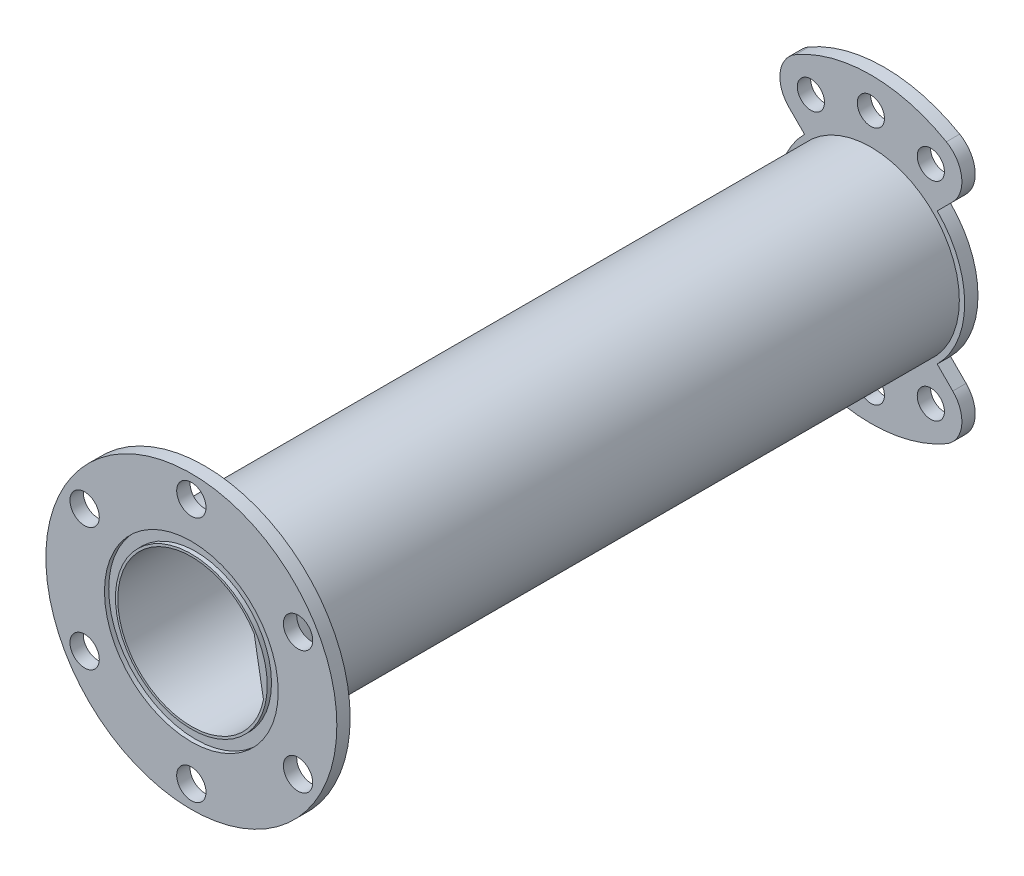
ISO-10303-21;
HEADER;
FILE_DESCRIPTION(('STEP AP214'),'2;1');
FILE_NAME('part.step','',(''),(''),'','','');
FILE_SCHEMA(('AUTOMOTIVE_DESIGN { 1 0 10303 214 1 1 1 1 }'));
ENDSEC;
DATA;
#1=APPLICATION_CONTEXT('core data for automotive mechanical design processes');
#2=APPLICATION_PROTOCOL_DEFINITION('international standard','automotive_design',2000,#1);
#3=PRODUCT_CONTEXT('',#1,'mechanical');
#4=PRODUCT('Part','Part','',(#3));
#5=PRODUCT_RELATED_PRODUCT_CATEGORY('part','',(#4));
#6=PRODUCT_DEFINITION_FORMATION('','',#4);
#7=PRODUCT_DEFINITION_CONTEXT('part definition',#1,'design');
#8=PRODUCT_DEFINITION('design','',#6,#7);
#9=PRODUCT_DEFINITION_SHAPE('','',#8);
#10=(LENGTH_UNIT() NAMED_UNIT(*) SI_UNIT(.MILLI.,.METRE.));
#11=(NAMED_UNIT(*) PLANE_ANGLE_UNIT() SI_UNIT($,.RADIAN.));
#12=(NAMED_UNIT(*) SI_UNIT($,.STERADIAN.) SOLID_ANGLE_UNIT());
#13=UNCERTAINTY_MEASURE_WITH_UNIT(LENGTH_MEASURE(1.E-05),#10,'distance_accuracy_value','');
#14=(GEOMETRIC_REPRESENTATION_CONTEXT(3) GLOBAL_UNCERTAINTY_ASSIGNED_CONTEXT((#13)) GLOBAL_UNIT_ASSIGNED_CONTEXT((#10,
#11,#12)) REPRESENTATION_CONTEXT('',''));
#15=CARTESIAN_POINT('',(0.,0.,0.));
#16=DIRECTION('',(0.,0.,1.));
#17=DIRECTION('',(1.,0.,0.));
#18=AXIS2_PLACEMENT_3D('',#15,#16,#17);
#19=CARTESIAN_POINT('',(-14.2875,24.7466759131403,127.));
#20=DIRECTION('',(0.,0.,-1.));
#21=DIRECTION('',(-1.,0.,0.));
#22=AXIS2_PLACEMENT_3D('',#19,#20,#21);
#23=CYLINDRICAL_SURFACE('',#22,7.39575421380445);
#24=DIRECTION('',(0.,0.,-1.));
#25=VECTOR('',#24,1.);
#26=CARTESIAN_POINT('',(-19.5170879565702,19.5170879565702,127.));
#27=LINE('',#26,#25);
#28=CARTESIAN_POINT('',(-19.5170879565702,19.5170879565702,-34.925));
#29=VERTEX_POINT('',#28);
#30=CARTESIAN_POINT('',(-19.5170879565701,19.5170879565702,-38.1));
#31=VERTEX_POINT('',#30);
#32=EDGE_CURVE('E158',#29,#31,#27,.T.);
#33=ORIENTED_EDGE('',*,*,#32,.F.);
#34=CARTESIAN_POINT('',(-14.2875,24.7466759131403,-34.925));
#35=DIRECTION('',(0.,0.,1.));
#36=DIRECTION('',(1.,0.,0.));
#37=AXIS2_PLACEMENT_3D('',#34,#35,#36);
#38=CIRCLE('',#37,7.39575421380445);
#39=CARTESIAN_POINT('',(-17.9853771069023,31.1515869424408,-34.925));
#40=VERTEX_POINT('',#39);
#41=EDGE_CURVE('E144',#40,#29,#38,.T.);
#42=ORIENTED_EDGE('',*,*,#41,.F.);
#43=DIRECTION('',(0.,0.,-1.));
#44=VECTOR('',#43,1.);
#45=CARTESIAN_POINT('',(-17.9853771069023,31.1515869424408,39.5083940674089));
#46=LINE('',#45,#44);
#47=CARTESIAN_POINT('',(-17.9853771069023,31.1515869424408,-38.1));
#48=VERTEX_POINT('',#47);
#49=EDGE_CURVE('E357',#40,#48,#46,.T.);
#50=ORIENTED_EDGE('',*,*,#49,.T.);
#51=CARTESIAN_POINT('',(-14.2875,24.7466759131403,-38.1));
#52=DIRECTION('',(0.,0.,-1.));
#53=DIRECTION('',(-1.,0.,0.));
#54=AXIS2_PLACEMENT_3D('',#51,#52,#53);
#55=CIRCLE('',#54,7.39575421380445);
#56=EDGE_CURVE('E166',#31,#48,#55,.T.);
#57=ORIENTED_EDGE('',*,*,#56,.F.);
#58=EDGE_LOOP('',(#33,#42,#50,#57));
#59=FACE_BOUND('',#58,.T.);
#60=ADVANCED_FACE('F43',(#59),#23,.T.);
#61=CARTESIAN_POINT('',(0.,0.,127.));
#62=DIRECTION('',(-0.707106781186549,-0.707106781186546,0.));
#63=DIRECTION('',(0.707106781186546,-0.707106781186549,0.));
#64=AXIS2_PLACEMENT_3D('',#61,#62,#63);
#65=PLANE('',#64);
#66=DIRECTION('',(0.,0.,-1.));
#67=VECTOR('',#66,1.);
#68=CARTESIAN_POINT('',(-15.8052507730817,15.8052507730817,60.0460030923268));
#69=LINE('',#68,#67);
#70=CARTESIAN_POINT('',(-15.8052507730817,15.8052507730817,-34.925));
#71=VERTEX_POINT('',#70);
#72=CARTESIAN_POINT('',(-15.8052507730817,15.8052507730817,-38.1));
#73=VERTEX_POINT('',#72);
#74=EDGE_CURVE('E160',#71,#73,#69,.T.);
#75=ORIENTED_EDGE('',*,*,#74,.F.);
#76=DIRECTION('',(0.707106781186546,-0.707106781186549,0.));
#77=VECTOR('',#76,1.);
#78=CARTESIAN_POINT('',(0.,0.,-34.925));
#79=LINE('',#78,#77);
#80=EDGE_CURVE('E61',#29,#71,#79,.T.);
#81=ORIENTED_EDGE('',*,*,#80,.F.);
#82=ORIENTED_EDGE('',*,*,#32,.T.);
#83=DIRECTION('',(-0.707106781186546,0.707106781186549,0.));
#84=VECTOR('',#83,1.);
#85=CARTESIAN_POINT('',(0.,0.,-38.1));
#86=LINE('',#85,#84);
#87=EDGE_CURVE('E256',#73,#31,#86,.T.);
#88=ORIENTED_EDGE('',*,*,#87,.F.);
#89=EDGE_LOOP('',(#75,#81,#82,#88));
#90=FACE_BOUND('',#89,.T.);
#91=ADVANCED_FACE('F156',(#90),#65,.T.);
#92=CARTESIAN_POINT('',(0.,0.,127.));
#93=DIRECTION('',(0.707106781186539,-0.707106781186556,0.));
#94=DIRECTION('',(0.707106781186556,0.707106781186539,0.));
#95=AXIS2_PLACEMENT_3D('',#92,#93,#94);
#96=PLANE('',#95);
#97=DIRECTION('',(-0.707106781186556,-0.707106781186539,0.));
#98=VECTOR('',#97,1.);
#99=CARTESIAN_POINT('',(0.,0.,-34.925));
#100=LINE('',#99,#98);
#101=CARTESIAN_POINT('',(-15.8052507730819,-15.8052507730815,-34.925));
#102=VERTEX_POINT('',#101);
#103=CARTESIAN_POINT('',(-19.5170879565701,-19.5170879565701,-34.925));
#104=VERTEX_POINT('',#103);
#105=EDGE_CURVE('E214',#102,#104,#100,.T.);
#106=ORIENTED_EDGE('',*,*,#105,.F.);
#107=DIRECTION('',(0.,0.,-1.));
#108=VECTOR('',#107,1.);
#109=CARTESIAN_POINT('',(-15.8052507730819,-15.8052507730815,60.0460030923268));
#110=LINE('',#109,#108);
#111=CARTESIAN_POINT('',(-15.8052507730819,-15.8052507730815,-38.1));
#112=VERTEX_POINT('',#111);
#113=EDGE_CURVE('E328',#102,#112,#110,.T.);
#114=ORIENTED_EDGE('',*,*,#113,.T.);
#115=DIRECTION('',(0.707106781186556,0.707106781186539,0.));
#116=VECTOR('',#115,1.);
#117=CARTESIAN_POINT('',(0.,0.,-38.1));
#118=LINE('',#117,#116);
#119=CARTESIAN_POINT('',(-19.5170879565701,-19.5170879565701,-38.1));
#120=VERTEX_POINT('',#119);
#121=EDGE_CURVE('E248',#120,#112,#118,.T.);
#122=ORIENTED_EDGE('',*,*,#121,.F.);
#123=DIRECTION('',(0.,0.,-1.));
#124=VECTOR('',#123,1.);
#125=CARTESIAN_POINT('',(-19.5170879565703,-19.5170879565698,127.));
#126=LINE('',#125,#124);
#127=EDGE_CURVE('E168',#104,#120,#126,.T.);
#128=ORIENTED_EDGE('',*,*,#127,.F.);
#129=EDGE_LOOP('',(#106,#114,#122,#128));
#130=FACE_BOUND('',#129,.T.);
#131=ADVANCED_FACE('F413',(#130),#96,.F.);
#132=CARTESIAN_POINT('',(-14.2874999999999,-24.7466759131404,127.));
#133=DIRECTION('',(0.,0.,-1.));
#134=DIRECTION('',(-1.,0.,0.));
#135=AXIS2_PLACEMENT_3D('',#132,#133,#134);
#136=CYLINDRICAL_SURFACE('',#135,7.39575421380469);
#137=DIRECTION('',(0.,0.,-1.));
#138=VECTOR('',#137,1.);
#139=CARTESIAN_POINT('',(-17.9853771069021,-31.1515869424411,39.5083940674089));
#140=LINE('',#139,#138);
#141=CARTESIAN_POINT('',(-17.985377106902,-31.1515869424409,-34.925));
#142=VERTEX_POINT('',#141);
#143=CARTESIAN_POINT('',(-17.9853771069022,-31.1515869424411,-38.1));
#144=VERTEX_POINT('',#143);
#145=EDGE_CURVE('E169',#142,#144,#140,.T.);
#146=ORIENTED_EDGE('',*,*,#145,.F.);
#147=CARTESIAN_POINT('',(-14.2874999999999,-24.7466759131404,-34.925));
#148=DIRECTION('',(0.,0.,1.));
#149=DIRECTION('',(1.,0.,0.));
#150=AXIS2_PLACEMENT_3D('',#147,#148,#149);
#151=CIRCLE('',#150,7.39575421380469);
#152=EDGE_CURVE('E217',#104,#142,#151,.T.);
#153=ORIENTED_EDGE('',*,*,#152,.F.);
#154=ORIENTED_EDGE('',*,*,#127,.T.);
#155=CARTESIAN_POINT('',(-14.2874999999999,-24.7466759131404,-38.1));
#156=DIRECTION('',(0.,0.,-1.));
#157=DIRECTION('',(-1.,0.,0.));
#158=AXIS2_PLACEMENT_3D('',#155,#156,#157);
#159=CIRCLE('',#158,7.39575421380469);
#160=EDGE_CURVE('E244',#144,#120,#159,.T.);
#161=ORIENTED_EDGE('',*,*,#160,.F.);
#162=EDGE_LOOP('',(#146,#153,#154,#161));
#163=FACE_BOUND('',#162,.T.);
#164=ADVANCED_FACE('F404',(#163),#136,.T.);
#165=CARTESIAN_POINT('',(14.2875000000002,-24.7466759131402,127.));
#166=DIRECTION('',(0.,0.,-1.));
#167=DIRECTION('',(-1.,0.,0.));
#168=AXIS2_PLACEMENT_3D('',#165,#166,#167);
#169=CYLINDRICAL_SURFACE('',#168,7.3957542138043);
#170=DIRECTION('',(0.,0.,-1.));
#171=VECTOR('',#170,1.);
#172=CARTESIAN_POINT('',(19.5170879565701,-19.5170879565704,127.));
#173=LINE('',#172,#171);
#174=CARTESIAN_POINT('',(19.5170879565701,-19.5170879565704,-34.925));
#175=VERTEX_POINT('',#174);
#176=CARTESIAN_POINT('',(19.5170879565703,-19.5170879565703,-38.1));
#177=VERTEX_POINT('',#176);
#178=EDGE_CURVE('E53',#175,#177,#173,.T.);
#179=ORIENTED_EDGE('',*,*,#178,.F.);
#180=CARTESIAN_POINT('',(14.2875000000002,-24.7466759131402,-34.925));
#181=DIRECTION('',(0.,0.,1.));
#182=DIRECTION('',(1.,0.,0.));
#183=AXIS2_PLACEMENT_3D('',#180,#181,#182);
#184=CIRCLE('',#183,7.3957542138043);
#185=CARTESIAN_POINT('',(17.9853771069024,-31.1515869424405,-34.925));
#186=VERTEX_POINT('',#185);
#187=EDGE_CURVE('E223',#186,#175,#184,.T.);
#188=ORIENTED_EDGE('',*,*,#187,.F.);
#189=DIRECTION('',(0.,0.,-1.));
#190=VECTOR('',#189,1.);
#191=CARTESIAN_POINT('',(17.9853771069024,-31.1515869424405,39.5083940674089));
#192=LINE('',#191,#190);
#193=CARTESIAN_POINT('',(17.9853771069025,-31.1515869424406,-38.1));
#194=VERTEX_POINT('',#193);
#195=EDGE_CURVE('E175',#186,#194,#192,.T.);
#196=ORIENTED_EDGE('',*,*,#195,.T.);
#197=CARTESIAN_POINT('',(14.2875000000002,-24.7466759131402,-38.1));
#198=DIRECTION('',(0.,0.,-1.));
#199=DIRECTION('',(-1.,0.,0.));
#200=AXIS2_PLACEMENT_3D('',#197,#198,#199);
#201=CIRCLE('',#200,7.3957542138043);
#202=EDGE_CURVE('E281',#177,#194,#201,.T.);
#203=ORIENTED_EDGE('',*,*,#202,.F.);
#204=EDGE_LOOP('',(#179,#188,#196,#203));
#205=FACE_BOUND('',#204,.T.);
#206=ADVANCED_FACE('F394',(#205),#169,.T.);
#207=CARTESIAN_POINT('',(0.,0.,127.));
#208=DIRECTION('',(0.707106781186554,0.707106781186541,0.));
#209=DIRECTION('',(-0.707106781186541,0.707106781186554,0.));
#210=AXIS2_PLACEMENT_3D('',#207,#208,#209);
#211=PLANE('',#210);
#212=DIRECTION('',(0.,0.,-1.));
#213=VECTOR('',#212,1.);
#214=CARTESIAN_POINT('',(15.8052507730816,-15.8052507730818,60.0460030923268));
#215=LINE('',#214,#213);
#216=CARTESIAN_POINT('',(15.8052507730816,-15.8052507730819,-34.925));
#217=VERTEX_POINT('',#216);
#218=CARTESIAN_POINT('',(15.8052507730816,-15.8052507730818,-38.1));
#219=VERTEX_POINT('',#218);
#220=EDGE_CURVE('E325',#217,#219,#215,.T.);
#221=ORIENTED_EDGE('',*,*,#220,.F.);
#222=DIRECTION('',(-0.707106781186541,0.707106781186554,0.));
#223=VECTOR('',#222,1.);
#224=CARTESIAN_POINT('',(0.,0.,-34.925));
#225=LINE('',#224,#223);
#226=EDGE_CURVE('E226',#175,#217,#225,.T.);
#227=ORIENTED_EDGE('',*,*,#226,.F.);
#228=ORIENTED_EDGE('',*,*,#178,.T.);
#229=DIRECTION('',(0.707106781186542,-0.707106781186554,0.));
#230=VECTOR('',#229,1.);
#231=CARTESIAN_POINT('',(0.,0.,-38.1));
#232=LINE('',#231,#230);
#233=EDGE_CURVE('E277',#219,#177,#232,.T.);
#234=ORIENTED_EDGE('',*,*,#233,.F.);
#235=EDGE_LOOP('',(#221,#227,#228,#234));
#236=FACE_BOUND('',#235,.T.);
#237=ADVANCED_FACE('F389',(#236),#211,.T.);
#238=CARTESIAN_POINT('',(0.,0.,127.));
#239=DIRECTION('',(-0.707106781186544,0.707106781186551,0.));
#240=DIRECTION('',(-0.707106781186551,-0.707106781186544,0.));
#241=AXIS2_PLACEMENT_3D('',#238,#239,#240);
#242=PLANE('',#241);
#243=DIRECTION('',(0.707106781186551,0.707106781186544,0.));
#244=VECTOR('',#243,1.);
#245=CARTESIAN_POINT('',(0.,0.,-34.925));
#246=LINE('',#245,#244);
#247=CARTESIAN_POINT('',(15.8052507730818,15.8052507730816,-34.925));
#248=VERTEX_POINT('',#247);
#249=CARTESIAN_POINT('',(19.5170879565702,19.51708795657,-34.925));
#250=VERTEX_POINT('',#249);
#251=EDGE_CURVE('E232',#248,#250,#246,.T.);
#252=ORIENTED_EDGE('',*,*,#251,.F.);
#253=DIRECTION('',(0.,0.,-1.));
#254=VECTOR('',#253,1.);
#255=CARTESIAN_POINT('',(15.8052507730818,15.8052507730816,60.0460030923268));
#256=LINE('',#255,#254);
#257=CARTESIAN_POINT('',(15.8052507730818,15.8052507730816,-38.1));
#258=VERTEX_POINT('',#257);
#259=EDGE_CURVE('E12',#248,#258,#256,.T.);
#260=ORIENTED_EDGE('',*,*,#259,.T.);
#261=DIRECTION('',(-0.707106781186551,-0.707106781186544,0.));
#262=VECTOR('',#261,1.);
#263=CARTESIAN_POINT('',(0.,0.,-38.1));
#264=LINE('',#263,#262);
#265=CARTESIAN_POINT('',(19.5170879565702,19.51708795657,-38.1));
#266=VERTEX_POINT('',#265);
#267=EDGE_CURVE('E269',#266,#258,#264,.T.);
#268=ORIENTED_EDGE('',*,*,#267,.F.);
#269=DIRECTION('',(0.,0.,-1.));
#270=VECTOR('',#269,1.);
#271=CARTESIAN_POINT('',(19.5170879565702,19.51708795657,127.));
#272=LINE('',#271,#270);
#273=EDGE_CURVE('E173',#250,#266,#272,.T.);
#274=ORIENTED_EDGE('',*,*,#273,.F.);
#275=EDGE_LOOP('',(#252,#260,#268,#274));
#276=FACE_BOUND('',#275,.T.);
#277=ADVANCED_FACE('F380',(#276),#242,.F.);
#278=CARTESIAN_POINT('',(14.2874999999997,24.7466759131405,127.));
#279=DIRECTION('',(0.,0.,-1.));
#280=DIRECTION('',(-1.,0.,0.));
#281=AXIS2_PLACEMENT_3D('',#278,#279,#280);
#282=CYLINDRICAL_SURFACE('',#281,7.39575421380503);
#283=DIRECTION('',(0.,0.,-1.));
#284=VECTOR('',#283,1.);
#285=CARTESIAN_POINT('',(17.9853771069021,31.1515869424415,39.5083940674089));
#286=LINE('',#285,#284);
#287=CARTESIAN_POINT('',(17.9853771069018,31.151586942441,-34.925));
#288=VERTEX_POINT('',#287);
#289=CARTESIAN_POINT('',(17.9853771069021,31.1515869424415,-38.1));
#290=VERTEX_POINT('',#289);
#291=EDGE_CURVE('E358',#288,#290,#286,.T.);
#292=ORIENTED_EDGE('',*,*,#291,.F.);
#293=CARTESIAN_POINT('',(14.2874999999997,24.7466759131405,-34.925));
#294=DIRECTION('',(0.,0.,1.));
#295=DIRECTION('',(1.,0.,0.));
#296=AXIS2_PLACEMENT_3D('',#293,#294,#295);
#297=CIRCLE('',#296,7.39575421380503);
#298=EDGE_CURVE('E235',#250,#288,#297,.T.);
#299=ORIENTED_EDGE('',*,*,#298,.F.);
#300=ORIENTED_EDGE('',*,*,#273,.T.);
#301=CARTESIAN_POINT('',(14.2874999999997,24.7466759131405,-38.1));
#302=DIRECTION('',(0.,0.,-1.));
#303=DIRECTION('',(-1.,0.,0.));
#304=AXIS2_PLACEMENT_3D('',#301,#302,#303);
#305=CIRCLE('',#304,7.39575421380503);
#306=EDGE_CURVE('E265',#290,#266,#305,.T.);
#307=ORIENTED_EDGE('',*,*,#306,.F.);
#308=EDGE_LOOP('',(#292,#299,#300,#307));
#309=FACE_BOUND('',#308,.T.);
#310=ADVANCED_FACE('F372',(#309),#282,.T.);
#311=CARTESIAN_POINT('',(0.,0.,39.5083940674089));
#312=DIRECTION('',(0.,0.,-1.));
#313=DIRECTION('',(-1.,0.,0.));
#314=AXIS2_PLACEMENT_3D('',#311,#312,#313);
#315=CYLINDRICAL_SURFACE('',#314,35.9707542138044);
#316=ORIENTED_EDGE('',*,*,#195,.F.);
#317=CARTESIAN_POINT('',(0.,0.,-34.925));
#318=DIRECTION('',(0.,0.,1.));
#319=DIRECTION('',(1.,0.,0.));
#320=AXIS2_PLACEMENT_3D('',#317,#318,#319);
#321=CIRCLE('',#320,35.9707542138044);
#322=EDGE_CURVE('E220',#142,#186,#321,.T.);
#323=ORIENTED_EDGE('',*,*,#322,.F.);
#324=ORIENTED_EDGE('',*,*,#145,.T.);
#325=CARTESIAN_POINT('',(0.,0.,-38.1));
#326=DIRECTION('',(0.,0.,-1.));
#327=DIRECTION('',(-1.,0.,0.));
#328=AXIS2_PLACEMENT_3D('',#325,#326,#327);
#329=CIRCLE('',#328,35.9707542138044);
#330=EDGE_CURVE('E285',#194,#144,#329,.T.);
#331=ORIENTED_EDGE('',*,*,#330,.F.);
#332=EDGE_LOOP('',(#316,#323,#324,#331));
#333=FACE_BOUND('',#332,.T.);
#334=ADVANCED_FACE('F399',(#333),#315,.T.);
#335=CARTESIAN_POINT('',(0.,0.,39.5083940674089));
#336=DIRECTION('',(0.,0.,-1.));
#337=DIRECTION('',(-1.,0.,0.));
#338=AXIS2_PLACEMENT_3D('',#335,#336,#337);
#339=CYLINDRICAL_SURFACE('',#338,35.9707542138044);
#340=ORIENTED_EDGE('',*,*,#49,.F.);
#341=CARTESIAN_POINT('',(0.,0.,-34.925));
#342=DIRECTION('',(0.,0.,1.));
#343=DIRECTION('',(1.,0.,0.));
#344=AXIS2_PLACEMENT_3D('',#341,#342,#343);
#345=CIRCLE('',#344,35.9707542138044);
#346=EDGE_CURVE('E147',#288,#40,#345,.T.);
#347=ORIENTED_EDGE('',*,*,#346,.F.);
#348=ORIENTED_EDGE('',*,*,#291,.T.);
#349=CARTESIAN_POINT('',(0.,0.,-38.1));
#350=DIRECTION('',(0.,0.,-1.));
#351=DIRECTION('',(-1.,0.,0.));
#352=AXIS2_PLACEMENT_3D('',#349,#350,#351);
#353=CIRCLE('',#352,35.9707542138044);
#354=EDGE_CURVE('E261',#48,#290,#353,.T.);
#355=ORIENTED_EDGE('',*,*,#354,.F.);
#356=EDGE_LOOP('',(#340,#347,#348,#355));
#357=FACE_BOUND('',#356,.T.);
#358=ADVANCED_FACE('F489',(#357),#339,.T.);
#359=CARTESIAN_POINT('',(0.,0.,60.0460030923268));
#360=DIRECTION('',(0.,0.,-1.));
#361=DIRECTION('',(-1.,0.,0.));
#362=AXIS2_PLACEMENT_3D('',#359,#360,#361);
#363=CYLINDRICAL_SURFACE('',#362,22.352);
#364=ORIENTED_EDGE('',*,*,#259,.F.);
#365=CARTESIAN_POINT('',(0.,0.,-34.925));
#366=DIRECTION('',(0.,0.,1.));
#367=DIRECTION('',(1.,0.,0.));
#368=AXIS2_PLACEMENT_3D('',#365,#366,#367);
#369=CIRCLE('',#368,22.352);
#370=EDGE_CURVE('E229',#217,#248,#369,.T.);
#371=ORIENTED_EDGE('',*,*,#370,.F.);
#372=ORIENTED_EDGE('',*,*,#220,.T.);
#373=CARTESIAN_POINT('',(0.,0.,-38.1));
#374=DIRECTION('',(0.,0.,-1.));
#375=DIRECTION('',(-1.,0.,0.));
#376=AXIS2_PLACEMENT_3D('',#373,#374,#375);
#377=CIRCLE('',#376,22.352);
#378=EDGE_CURVE('E273',#258,#219,#377,.T.);
#379=ORIENTED_EDGE('',*,*,#378,.F.);
#380=EDGE_LOOP('',(#364,#371,#372,#379));
#381=FACE_BOUND('',#380,.T.);
#382=ADVANCED_FACE('F384',(#381),#363,.T.);
#383=ORIENTED_EDGE('',*,*,#113,.F.);
#384=CARTESIAN_POINT('',(0.,0.,-34.925));
#385=DIRECTION('',(0.,0.,1.));
#386=DIRECTION('',(1.,0.,0.));
#387=AXIS2_PLACEMENT_3D('',#384,#385,#386);
#388=CIRCLE('',#387,22.352);
#389=EDGE_CURVE('E162',#71,#102,#388,.T.);
#390=ORIENTED_EDGE('',*,*,#389,.F.);
#391=ORIENTED_EDGE('',*,*,#74,.T.);
#392=CARTESIAN_POINT('',(0.,0.,-38.1));
#393=DIRECTION('',(0.,0.,-1.));
#394=DIRECTION('',(-1.,0.,0.));
#395=AXIS2_PLACEMENT_3D('',#392,#393,#394);
#396=CIRCLE('',#395,22.352);
#397=EDGE_CURVE('E252',#112,#73,#396,.T.);
#398=ORIENTED_EDGE('',*,*,#397,.F.);
#399=EDGE_LOOP('',(#383,#390,#391,#398));
#400=FACE_BOUND('',#399,.T.);
#401=ADVANCED_FACE('F411',(#400),#363,.T.);
#402=CARTESIAN_POINT('',(0.,0.,123.825));
#403=DIRECTION('',(0.,0.,-1.));
#404=DIRECTION('',(-1.,0.,0.));
#405=AXIS2_PLACEMENT_3D('',#402,#403,#404);
#406=PLANE('',#405);
#407=CARTESIAN_POINT('',(0.,29.3624,123.825));
#408=DIRECTION('',(0.,0.,-1.));
#409=DIRECTION('',(-1.,0.,0.));
#410=AXIS2_PLACEMENT_3D('',#407,#408,#409);
#411=CIRCLE('',#410,3.4925);
#412=CARTESIAN_POINT('',(-3.4925,29.3624,123.825));
#413=VERTEX_POINT('',#412);
#414=EDGE_CURVE('E442',#413,#413,#411,.T.);
#415=ORIENTED_EDGE('',*,*,#414,.F.);
#416=EDGE_LOOP('',(#415));
#417=FACE_BOUND('',#416,.T.);
#418=CARTESIAN_POINT('',(-25.42858431608,14.6812000000003,123.825));
#419=DIRECTION('',(0.,0.,-1.));
#420=DIRECTION('',(-1.,0.,0.));
#421=AXIS2_PLACEMENT_3D('',#418,#419,#420);
#422=CIRCLE('',#421,3.4925);
#423=CARTESIAN_POINT('',(-28.92108431608,14.6812000000003,123.825));
#424=VERTEX_POINT('',#423);
#425=EDGE_CURVE('E446',#424,#424,#422,.T.);
#426=ORIENTED_EDGE('',*,*,#425,.F.);
#427=EDGE_LOOP('',(#426));
#428=FACE_BOUND('',#427,.T.);
#429=CARTESIAN_POINT('',(-25.4285843160803,-14.6811999999998,123.825));
#430=DIRECTION('',(0.,0.,-1.));
#431=DIRECTION('',(-1.,0.,0.));
#432=AXIS2_PLACEMENT_3D('',#429,#430,#431);
#433=CIRCLE('',#432,3.4925);
#434=CARTESIAN_POINT('',(-28.9210843160803,-14.6811999999998,123.825));
#435=VERTEX_POINT('',#434);
#436=EDGE_CURVE('E450',#435,#435,#433,.T.);
#437=ORIENTED_EDGE('',*,*,#436,.F.);
#438=EDGE_LOOP('',(#437));
#439=FACE_BOUND('',#438,.T.);
#440=CARTESIAN_POINT('',(0.,-29.3624,123.825));
#441=DIRECTION('',(0.,0.,-1.));
#442=DIRECTION('',(-1.,0.,0.));
#443=AXIS2_PLACEMENT_3D('',#440,#441,#442);
#444=CIRCLE('',#443,3.4925);
#445=CARTESIAN_POINT('',(-3.4925,-29.3624,123.825));
#446=VERTEX_POINT('',#445);
#447=EDGE_CURVE('E454',#446,#446,#444,.T.);
#448=ORIENTED_EDGE('',*,*,#447,.F.);
#449=EDGE_LOOP('',(#448));
#450=FACE_BOUND('',#449,.T.);
#451=CARTESIAN_POINT('',(25.4285843160801,-14.6812000000001,123.825));
#452=DIRECTION('',(0.,0.,-1.));
#453=DIRECTION('',(-1.,0.,0.));
#454=AXIS2_PLACEMENT_3D('',#451,#452,#453);
#455=CIRCLE('',#454,3.4925);
#456=CARTESIAN_POINT('',(21.9360843160801,-14.6812000000001,123.825));
#457=VERTEX_POINT('',#456);
#458=EDGE_CURVE('E458',#457,#457,#455,.T.);
#459=ORIENTED_EDGE('',*,*,#458,.F.);
#460=EDGE_LOOP('',(#459));
#461=FACE_BOUND('',#460,.T.);
#462=CARTESIAN_POINT('',(25.4285843160802,14.6811999999999,123.825));
#463=DIRECTION('',(0.,0.,-1.));
#464=DIRECTION('',(-1.,0.,0.));
#465=AXIS2_PLACEMENT_3D('',#462,#463,#464);
#466=CIRCLE('',#465,3.4925);
#467=CARTESIAN_POINT('',(21.9360843160802,14.6811999999999,123.825));
#468=VERTEX_POINT('',#467);
#469=EDGE_CURVE('E462',#468,#468,#466,.T.);
#470=ORIENTED_EDGE('',*,*,#469,.F.);
#471=EDGE_LOOP('',(#470));
#472=FACE_BOUND('',#471,.T.);
#473=CARTESIAN_POINT('',(0.,0.,123.825));
#474=DIRECTION('',(0.,0.,-1.));
#475=DIRECTION('',(-1.,0.,0.));
#476=AXIS2_PLACEMENT_3D('',#473,#474,#475);
#477=CIRCLE('',#476,34.671);
#478=CARTESIAN_POINT('',(-34.671,0.,123.825));
#479=VERTEX_POINT('',#478);
#480=EDGE_CURVE('E321',#479,#479,#477,.T.);
#481=ORIENTED_EDGE('',*,*,#480,.T.);
#482=EDGE_LOOP('',(#481));
#483=FACE_BOUND('',#482,.T.);
#484=CARTESIAN_POINT('',(0.,0.,123.825));
#485=DIRECTION('',(0.,0.,-1.));
#486=DIRECTION('',(-1.,0.,0.));
#487=AXIS2_PLACEMENT_3D('',#484,#485,#486);
#488=CIRCLE('',#487,21.082);
#489=CARTESIAN_POINT('',(-21.082,0.,123.825));
#490=VERTEX_POINT('',#489);
#491=EDGE_CURVE('E353',#490,#490,#488,.T.);
#492=ORIENTED_EDGE('',*,*,#491,.F.);
#493=EDGE_LOOP('',(#492));
#494=FACE_BOUND('',#493,.T.);
#495=ADVANCED_FACE('F428',(#417,#428,#439,#450,#461,#472,#483,#494),#406,.T.);
#496=CARTESIAN_POINT('',(0.,0.,127.));
#497=DIRECTION('',(0.,0.,1.));
#498=DIRECTION('',(1.,0.,0.));
#499=AXIS2_PLACEMENT_3D('',#496,#497,#498);
#500=PLANE('',#499);
#501=CARTESIAN_POINT('',(0.,29.3624,127.));
#502=DIRECTION('',(0.,0.,1.));
#503=DIRECTION('',(1.,0.,0.));
#504=AXIS2_PLACEMENT_3D('',#501,#502,#503);
#505=CIRCLE('',#504,3.4925);
#506=CARTESIAN_POINT('',(3.4925,29.3624,127.));
#507=VERTEX_POINT('',#506);
#508=EDGE_CURVE('E584',#507,#507,#505,.T.);
#509=ORIENTED_EDGE('',*,*,#508,.F.);
#510=EDGE_LOOP('',(#509));
#511=FACE_BOUND('',#510,.T.);
#512=CARTESIAN_POINT('',(-25.42858431608,14.6812000000003,127.));
#513=DIRECTION('',(0.,0.,1.));
#514=DIRECTION('',(1.,0.,0.));
#515=AXIS2_PLACEMENT_3D('',#512,#513,#514);
#516=CIRCLE('',#515,3.4925);
#517=CARTESIAN_POINT('',(-21.93608431608,14.6812000000003,127.));
#518=VERTEX_POINT('',#517);
#519=EDGE_CURVE('E595',#518,#518,#516,.T.);
#520=ORIENTED_EDGE('',*,*,#519,.F.);
#521=EDGE_LOOP('',(#520));
#522=FACE_BOUND('',#521,.T.);
#523=CARTESIAN_POINT('',(-25.4285843160803,-14.6811999999998,127.));
#524=DIRECTION('',(0.,0.,1.));
#525=DIRECTION('',(1.,0.,0.));
#526=AXIS2_PLACEMENT_3D('',#523,#524,#525);
#527=CIRCLE('',#526,3.4925);
#528=CARTESIAN_POINT('',(-21.9360843160803,-14.6811999999998,127.));
#529=VERTEX_POINT('',#528);
#530=EDGE_CURVE('E598',#529,#529,#527,.T.);
#531=ORIENTED_EDGE('',*,*,#530,.F.);
#532=EDGE_LOOP('',(#531));
#533=FACE_BOUND('',#532,.T.);
#534=CARTESIAN_POINT('',(0.,-29.3624,127.));
#535=DIRECTION('',(0.,0.,1.));
#536=DIRECTION('',(1.,0.,0.));
#537=AXIS2_PLACEMENT_3D('',#534,#535,#536);
#538=CIRCLE('',#537,3.4925);
#539=CARTESIAN_POINT('',(3.4925,-29.3624,127.));
#540=VERTEX_POINT('',#539);
#541=EDGE_CURVE('E603',#540,#540,#538,.T.);
#542=ORIENTED_EDGE('',*,*,#541,.F.);
#543=EDGE_LOOP('',(#542));
#544=FACE_BOUND('',#543,.T.);
#545=CARTESIAN_POINT('',(25.4285843160801,-14.6812000000001,127.));
#546=DIRECTION('',(0.,0.,1.));
#547=DIRECTION('',(1.,0.,0.));
#548=AXIS2_PLACEMENT_3D('',#545,#546,#547);
#549=CIRCLE('',#548,3.4925);
#550=CARTESIAN_POINT('',(28.9210843160801,-14.6812000000001,127.));
#551=VERTEX_POINT('',#550);
#552=EDGE_CURVE('E592',#551,#551,#549,.T.);
#553=ORIENTED_EDGE('',*,*,#552,.F.);
#554=EDGE_LOOP('',(#553));
#555=FACE_BOUND('',#554,.T.);
#556=CARTESIAN_POINT('',(25.4285843160802,14.6811999999999,127.));
#557=DIRECTION('',(0.,0.,1.));
#558=DIRECTION('',(1.,0.,0.));
#559=AXIS2_PLACEMENT_3D('',#556,#557,#558);
#560=CIRCLE('',#559,3.4925);
#561=CARTESIAN_POINT('',(28.9210843160802,14.6811999999999,127.));
#562=VERTEX_POINT('',#561);
#563=EDGE_CURVE('E586',#562,#562,#560,.T.);
#564=ORIENTED_EDGE('',*,*,#563,.F.);
#565=EDGE_LOOP('',(#564));
#566=FACE_BOUND('',#565,.T.);
#567=CARTESIAN_POINT('',(0.,0.,127.));
#568=DIRECTION('',(0.,0.,1.));
#569=DIRECTION('',(1.,0.,0.));
#570=AXIS2_PLACEMENT_3D('',#567,#568,#569);
#571=CIRCLE('',#570,34.671);
#572=CARTESIAN_POINT('',(34.671,0.,127.));
#573=VERTEX_POINT('',#572);
#574=EDGE_CURVE('E317',#573,#573,#571,.T.);
#575=ORIENTED_EDGE('',*,*,#574,.T.);
#576=EDGE_LOOP('',(#575));
#577=FACE_BOUND('',#576,.T.);
#578=CARTESIAN_POINT('',(0.,0.,127.));
#579=DIRECTION('',(0.,0.,1.));
#580=DIRECTION('',(1.,0.,0.));
#581=AXIS2_PLACEMENT_3D('',#578,#579,#580);
#582=CIRCLE('',#581,20.701);
#583=CARTESIAN_POINT('',(20.701,0.,127.));
#584=VERTEX_POINT('',#583);
#585=EDGE_CURVE('E338',#584,#584,#582,.T.);
#586=ORIENTED_EDGE('',*,*,#585,.F.);
#587=EDGE_LOOP('',(#586));
#588=FACE_BOUND('',#587,.T.);
#589=ADVANCED_FACE('F45',(#511,#522,#533,#544,#555,#566,#577,#588),#500,.T.);
#590=CARTESIAN_POINT('',(0.,0.,127.));
#591=DIRECTION('',(0.,0.,1.));
#592=DIRECTION('',(1.,0.,0.));
#593=AXIS2_PLACEMENT_3D('',#590,#591,#592);
#594=CIRCLE('',#593,17.526);
#595=CARTESIAN_POINT('',(14.9843481038095,9.09010384450369,127.));
#596=VERTEX_POINT('',#595);
#597=CARTESIAN_POINT('',(17.1896799601794,-3.41695461875136,127.));
#598=VERTEX_POINT('',#597);
#599=EDGE_CURVE('E346',#596,#598,#594,.T.);
#600=ORIENTED_EDGE('',*,*,#599,.F.);
#601=DIRECTION('',(-0.173648177666923,0.984807753012209,0.));
#602=VECTOR('',#601,1.);
#603=CARTESIAN_POINT('',(16.0870140319945,2.83657461287617,127.));
#604=LINE('',#603,#602);
#605=EDGE_CURVE('E69',#598,#596,#604,.T.);
#606=ORIENTED_EDGE('',*,*,#605,.F.);
#607=EDGE_LOOP('',(#600,#606));
#608=FACE_BOUND('',#607,.T.);
#609=CARTESIAN_POINT('',(0.,0.,127.));
#610=DIRECTION('',(0.,0.,1.));
#611=DIRECTION('',(1.,0.,0.));
#612=AXIS2_PLACEMENT_3D('',#609,#610,#611);
#613=CIRCLE('',#612,18.0848);
#614=CARTESIAN_POINT('',(18.0848,0.,127.));
#615=VERTEX_POINT('',#614);
#616=EDGE_CURVE('E333',#615,#615,#613,.T.);
#617=ORIENTED_EDGE('',*,*,#616,.T.);
#618=EDGE_LOOP('',(#617));
#619=FACE_BOUND('',#618,.T.);
#620=ADVANCED_FACE('F435',(#608,#619),#500,.T.);
#621=CARTESIAN_POINT('',(0.,0.,127.));
#622=DIRECTION('',(0.,0.,-1.));
#623=DIRECTION('',(-1.,0.,0.));
#624=AXIS2_PLACEMENT_3D('',#621,#622,#623);
#625=CYLINDRICAL_SURFACE('',#624,21.082);
#626=ORIENTED_EDGE('',*,*,#491,.T.);
#627=EDGE_LOOP('',(#626));
#628=FACE_BOUND('',#627,.T.);
#629=CARTESIAN_POINT('',(0.,0.,-34.925));
#630=DIRECTION('',(0.,0.,1.));
#631=DIRECTION('',(1.,0.,0.));
#632=AXIS2_PLACEMENT_3D('',#629,#630,#631);
#633=CIRCLE('',#632,21.082);
#634=CARTESIAN_POINT('',(21.082,0.,-34.925));
#635=VERTEX_POINT('',#634);
#636=EDGE_CURVE('E152',#635,#635,#633,.F.);
#637=ORIENTED_EDGE('',*,*,#636,.F.);
#638=EDGE_LOOP('',(#637));
#639=FACE_BOUND('',#638,.T.);
#640=ADVANCED_FACE('F467',(#628,#639),#625,.T.);
#641=CARTESIAN_POINT('',(0.,0.,-6.35000000000002));
#642=DIRECTION('',(0.,0.,1.));
#643=DIRECTION('',(1.,0.,0.));
#644=AXIS2_PLACEMENT_3D('',#641,#642,#643);
#645=CYLINDRICAL_SURFACE('',#644,17.526);
#646=ORIENTED_EDGE('',*,*,#599,.T.);
#647=DIRECTION('',(0.,0.,-1.));
#648=VECTOR('',#647,1.);
#649=CARTESIAN_POINT('',(17.1896799601794,-3.41695461875136,139.762699783537));
#650=LINE('',#649,#648);
#651=CARTESIAN_POINT('',(17.1896799601794,-3.41695461875136,-38.1));
#652=VERTEX_POINT('',#651);
#653=EDGE_CURVE('E309',#598,#652,#650,.T.);
#654=ORIENTED_EDGE('',*,*,#653,.T.);
#655=CARTESIAN_POINT('',(0.,0.,-38.1));
#656=DIRECTION('',(0.,0.,-1.));
#657=DIRECTION('',(-1.,0.,0.));
#658=AXIS2_PLACEMENT_3D('',#655,#656,#657);
#659=CIRCLE('',#658,17.526);
#660=CARTESIAN_POINT('',(14.9843481038095,9.09010384450371,-38.1));
#661=VERTEX_POINT('',#660);
#662=EDGE_CURVE('E301',#661,#652,#659,.F.);
#663=ORIENTED_EDGE('',*,*,#662,.F.);
#664=DIRECTION('',(0.,0.,-1.));
#665=VECTOR('',#664,1.);
#666=CARTESIAN_POINT('',(14.9843481038095,9.09010384450371,139.762699783537));
#667=LINE('',#666,#665);
#668=EDGE_CURVE('E312',#596,#661,#667,.T.);
#669=ORIENTED_EDGE('',*,*,#668,.F.);
#670=EDGE_LOOP('',(#646,#654,#663,#669));
#671=FACE_BOUND('',#670,.T.);
#672=ADVANCED_FACE('F470',(#671),#645,.F.);
#673=CARTESIAN_POINT('',(0.,0.,125.984));
#674=DIRECTION('',(0.,0.,1.));
#675=DIRECTION('',(1.,0.,0.));
#676=AXIS2_PLACEMENT_3D('',#673,#674,#675);
#677=CYLINDRICAL_SURFACE('',#676,20.701);
#678=CARTESIAN_POINT('',(0.,0.,125.984));
#679=DIRECTION('',(0.,0.,1.));
#680=DIRECTION('',(1.,0.,0.));
#681=AXIS2_PLACEMENT_3D('',#678,#679,#680);
#682=CIRCLE('',#681,20.701);
#683=CARTESIAN_POINT('',(20.701,0.,125.984));
#684=VERTEX_POINT('',#683);
#685=EDGE_CURVE('E342',#684,#684,#682,.T.);
#686=ORIENTED_EDGE('',*,*,#685,.F.);
#687=EDGE_LOOP('',(#686));
#688=FACE_BOUND('',#687,.T.);
#689=ORIENTED_EDGE('',*,*,#585,.T.);
#690=EDGE_LOOP('',(#689));
#691=FACE_BOUND('',#690,.T.);
#692=ADVANCED_FACE('F474',(#688,#691),#677,.F.);
#693=CARTESIAN_POINT('',(0.,0.,125.984));
#694=DIRECTION('',(0.,0.,1.));
#695=DIRECTION('',(1.,0.,0.));
#696=AXIS2_PLACEMENT_3D('',#693,#694,#695);
#697=PLANE('',#696);
#698=CARTESIAN_POINT('',(0.,0.,125.984));
#699=DIRECTION('',(0.,0.,1.));
#700=DIRECTION('',(1.,0.,0.));
#701=AXIS2_PLACEMENT_3D('',#698,#699,#700);
#702=CIRCLE('',#701,18.0848);
#703=CARTESIAN_POINT('',(18.0848,0.,125.984));
#704=VERTEX_POINT('',#703);
#705=EDGE_CURVE('E334',#704,#704,#702,.T.);
#706=ORIENTED_EDGE('',*,*,#705,.F.);
#707=EDGE_LOOP('',(#706));
#708=FACE_BOUND('',#707,.T.);
#709=ORIENTED_EDGE('',*,*,#685,.T.);
#710=EDGE_LOOP('',(#709));
#711=FACE_BOUND('',#710,.T.);
#712=ADVANCED_FACE('F495',(#708,#711),#697,.T.);
#713=CARTESIAN_POINT('',(0.,0.,125.984));
#714=DIRECTION('',(0.,0.,1.));
#715=DIRECTION('',(1.,0.,0.));
#716=AXIS2_PLACEMENT_3D('',#713,#714,#715);
#717=CYLINDRICAL_SURFACE('',#716,18.0848);
#718=ORIENTED_EDGE('',*,*,#705,.T.);
#719=EDGE_LOOP('',(#718));
#720=FACE_BOUND('',#719,.T.);
#721=ORIENTED_EDGE('',*,*,#616,.F.);
#722=EDGE_LOOP('',(#721));
#723=FACE_BOUND('',#722,.T.);
#724=ADVANCED_FACE('F499',(#720,#723),#717,.T.);
#725=CARTESIAN_POINT('',(0.,0.,101.6));
#726=DIRECTION('',(0.,0.,1.));
#727=DIRECTION('',(1.,0.,0.));
#728=AXIS2_PLACEMENT_3D('',#725,#726,#727);
#729=CYLINDRICAL_SURFACE('',#728,34.671);
#730=ORIENTED_EDGE('',*,*,#574,.F.);
#731=EDGE_LOOP('',(#730));
#732=FACE_BOUND('',#731,.T.);
#733=ORIENTED_EDGE('',*,*,#480,.F.);
#734=EDGE_LOOP('',(#733));
#735=FACE_BOUND('',#734,.T.);
#736=ADVANCED_FACE('F502',(#732,#735),#729,.T.);
#737=CARTESIAN_POINT('',(16.0870140319945,2.83657461287617,139.762699783537));
#738=DIRECTION('',(-0.984807753012209,-0.173648177666923,0.));
#739=DIRECTION('',(0.173648177666923,-0.984807753012209,0.));
#740=AXIS2_PLACEMENT_3D('',#737,#738,#739);
#741=PLANE('',#740);
#742=ORIENTED_EDGE('',*,*,#653,.F.);
#743=ORIENTED_EDGE('',*,*,#605,.T.);
#744=ORIENTED_EDGE('',*,*,#668,.T.);
#745=DIRECTION('',(-0.173648177666923,0.984807753012209,0.));
#746=VECTOR('',#745,1.);
#747=CARTESIAN_POINT('',(16.0870140319945,2.83657461287617,-38.1));
#748=LINE('',#747,#746);
#749=EDGE_CURVE('E297',#652,#661,#748,.T.);
#750=ORIENTED_EDGE('',*,*,#749,.F.);
#751=EDGE_LOOP('',(#742,#743,#744,#750));
#752=FACE_BOUND('',#751,.T.);
#753=ADVANCED_FACE('F508',(#752),#741,.T.);
#754=CARTESIAN_POINT('',(0.,0.,-37.084));
#755=DIRECTION('',(0.,0.,-1.));
#756=DIRECTION('',(-1.,0.,0.));
#757=AXIS2_PLACEMENT_3D('',#754,#755,#756);
#758=PLANE('',#757);
#759=CARTESIAN_POINT('',(0.,0.,-37.084));
#760=DIRECTION('',(0.,0.,-1.));
#761=DIRECTION('',(-1.,0.,0.));
#762=AXIS2_PLACEMENT_3D('',#759,#760,#761);
#763=CIRCLE('',#762,20.701);
#764=CARTESIAN_POINT('',(-20.701,0.,-37.084));
#765=VERTEX_POINT('',#764);
#766=EDGE_CURVE('E289',#765,#765,#763,.T.);
#767=ORIENTED_EDGE('',*,*,#766,.T.);
#768=EDGE_LOOP('',(#767));
#769=FACE_BOUND('',#768,.T.);
#770=CARTESIAN_POINT('',(0.,0.,-37.084));
#771=DIRECTION('',(0.,0.,-1.));
#772=DIRECTION('',(-1.,0.,0.));
#773=AXIS2_PLACEMENT_3D('',#770,#771,#772);
#774=CIRCLE('',#773,18.0848);
#775=CARTESIAN_POINT('',(-18.0848,0.,-37.084));
#776=VERTEX_POINT('',#775);
#777=EDGE_CURVE('E305',#776,#776,#774,.F.);
#778=ORIENTED_EDGE('',*,*,#777,.T.);
#779=EDGE_LOOP('',(#778));
#780=FACE_BOUND('',#779,.T.);
#781=ADVANCED_FACE('F512',(#769,#780),#758,.T.);
#782=CARTESIAN_POINT('',(0.,0.,-38.1));
#783=DIRECTION('',(0.,0.,1.));
#784=DIRECTION('',(1.,0.,0.));
#785=AXIS2_PLACEMENT_3D('',#782,#783,#784);
#786=CYLINDRICAL_SURFACE('',#785,18.0848);
#787=ORIENTED_EDGE('',*,*,#777,.F.);
#788=EDGE_LOOP('',(#787));
#789=FACE_BOUND('',#788,.T.);
#790=CARTESIAN_POINT('',(0.,0.,-38.1));
#791=DIRECTION('',(0.,0.,-1.));
#792=DIRECTION('',(-1.,0.,0.));
#793=AXIS2_PLACEMENT_3D('',#790,#791,#792);
#794=CIRCLE('',#793,18.0848);
#795=CARTESIAN_POINT('',(-18.0848,0.,-38.1));
#796=VERTEX_POINT('',#795);
#797=EDGE_CURVE('E293',#796,#796,#794,.T.);
#798=ORIENTED_EDGE('',*,*,#797,.F.);
#799=EDGE_LOOP('',(#798));
#800=FACE_BOUND('',#799,.T.);
#801=ADVANCED_FACE('F515',(#789,#800),#786,.T.);
#802=CARTESIAN_POINT('',(0.,0.,-38.1));
#803=DIRECTION('',(0.,0.,-1.));
#804=DIRECTION('',(-1.,0.,0.));
#805=AXIS2_PLACEMENT_3D('',#802,#803,#804);
#806=PLANE('',#805);
#807=ORIENTED_EDGE('',*,*,#797,.T.);
#808=EDGE_LOOP('',(#807));
#809=FACE_BOUND('',#808,.T.);
#810=ORIENTED_EDGE('',*,*,#749,.T.);
#811=ORIENTED_EDGE('',*,*,#662,.T.);
#812=EDGE_LOOP('',(#810,#811));
#813=FACE_BOUND('',#812,.T.);
#814=ADVANCED_FACE('F519',(#809,#813),#806,.T.);
#815=CARTESIAN_POINT('',(0.,0.,-38.1));
#816=DIRECTION('',(0.,0.,1.));
#817=DIRECTION('',(1.,0.,0.));
#818=AXIS2_PLACEMENT_3D('',#815,#816,#817);
#819=CYLINDRICAL_SURFACE('',#818,20.701);
#820=ORIENTED_EDGE('',*,*,#766,.F.);
#821=EDGE_LOOP('',(#820));
#822=FACE_BOUND('',#821,.T.);
#823=CARTESIAN_POINT('',(0.,0.,-38.1));
#824=DIRECTION('',(0.,0.,-1.));
#825=DIRECTION('',(-1.,0.,0.));
#826=AXIS2_PLACEMENT_3D('',#823,#824,#825);
#827=CIRCLE('',#826,20.701);
#828=CARTESIAN_POINT('',(-20.701,0.,-38.1));
#829=VERTEX_POINT('',#828);
#830=EDGE_CURVE('E240',#829,#829,#827,.F.);
#831=ORIENTED_EDGE('',*,*,#830,.F.);
#832=EDGE_LOOP('',(#831));
#833=FACE_BOUND('',#832,.T.);
#834=ADVANCED_FACE('F523',(#822,#833),#819,.F.);
#835=CARTESIAN_POINT('',(0.,0.,-38.1));
#836=DIRECTION('',(0.,0.,-1.));
#837=DIRECTION('',(-1.,0.,0.));
#838=AXIS2_PLACEMENT_3D('',#835,#836,#837);
#839=PLANE('',#838);
#840=CARTESIAN_POINT('',(14.2875000000002,-24.7466759131402,-38.1));
#841=DIRECTION('',(0.,0.,-1.));
#842=DIRECTION('',(-1.,0.,0.));
#843=AXIS2_PLACEMENT_3D('',#840,#841,#842);
#844=CIRCLE('',#843,3.2385);
#845=CARTESIAN_POINT('',(11.0490000000002,-24.7466759131402,-38.1));
#846=VERTEX_POINT('',#845);
#847=EDGE_CURVE('E620',#846,#846,#844,.T.);
#848=ORIENTED_EDGE('',*,*,#847,.F.);
#849=EDGE_LOOP('',(#848));
#850=FACE_BOUND('',#849,.T.);
#851=CARTESIAN_POINT('',(0.,-28.575,-38.1));
#852=DIRECTION('',(0.,0.,-1.));
#853=DIRECTION('',(-1.,0.,0.));
#854=AXIS2_PLACEMENT_3D('',#851,#852,#853);
#855=CIRCLE('',#854,3.2385);
#856=CARTESIAN_POINT('',(-3.2385,-28.575,-38.1));
#857=VERTEX_POINT('',#856);
#858=EDGE_CURVE('E633',#857,#857,#855,.T.);
#859=ORIENTED_EDGE('',*,*,#858,.F.);
#860=EDGE_LOOP('',(#859));
#861=FACE_BOUND('',#860,.T.);
#862=CARTESIAN_POINT('',(-14.2874999999999,-24.7466759131404,-38.1));
#863=DIRECTION('',(0.,0.,-1.));
#864=DIRECTION('',(-1.,0.,0.));
#865=AXIS2_PLACEMENT_3D('',#862,#863,#864);
#866=CIRCLE('',#865,3.2385);
#867=CARTESIAN_POINT('',(-17.5259999999999,-24.7466759131404,-38.1));
#868=VERTEX_POINT('',#867);
#869=EDGE_CURVE('E629',#868,#868,#866,.T.);
#870=ORIENTED_EDGE('',*,*,#869,.F.);
#871=EDGE_LOOP('',(#870));
#872=FACE_BOUND('',#871,.T.);
#873=CARTESIAN_POINT('',(-14.2875,24.7466759131403,-38.1));
#874=DIRECTION('',(0.,0.,-1.));
#875=DIRECTION('',(-1.,0.,0.));
#876=AXIS2_PLACEMENT_3D('',#873,#874,#875);
#877=CIRCLE('',#876,3.2385);
#878=CARTESIAN_POINT('',(-17.526,24.7466759131403,-38.1));
#879=VERTEX_POINT('',#878);
#880=EDGE_CURVE('E625',#879,#879,#877,.T.);
#881=ORIENTED_EDGE('',*,*,#880,.F.);
#882=EDGE_LOOP('',(#881));
#883=FACE_BOUND('',#882,.T.);
#884=CARTESIAN_POINT('',(0.,28.575,-38.1));
#885=DIRECTION('',(0.,0.,-1.));
#886=DIRECTION('',(-1.,0.,0.));
#887=AXIS2_PLACEMENT_3D('',#884,#885,#886);
#888=CIRCLE('',#887,3.2385);
#889=CARTESIAN_POINT('',(-3.2385,28.575,-38.1));
#890=VERTEX_POINT('',#889);
#891=EDGE_CURVE('E621',#890,#890,#888,.T.);
#892=ORIENTED_EDGE('',*,*,#891,.F.);
#893=EDGE_LOOP('',(#892));
#894=FACE_BOUND('',#893,.T.);
#895=CARTESIAN_POINT('',(14.2874999999997,24.7466759131405,-38.1));
#896=DIRECTION('',(0.,0.,-1.));
#897=DIRECTION('',(-1.,0.,0.));
#898=AXIS2_PLACEMENT_3D('',#895,#896,#897);
#899=CIRCLE('',#898,3.2385);
#900=CARTESIAN_POINT('',(11.0489999999997,24.7466759131405,-38.1));
#901=VERTEX_POINT('',#900);
#902=EDGE_CURVE('E184',#901,#901,#899,.T.);
#903=ORIENTED_EDGE('',*,*,#902,.F.);
#904=EDGE_LOOP('',(#903));
#905=FACE_BOUND('',#904,.T.);
#906=ORIENTED_EDGE('',*,*,#830,.T.);
#907=EDGE_LOOP('',(#906));
#908=FACE_BOUND('',#907,.T.);
#909=ORIENTED_EDGE('',*,*,#160,.T.);
#910=ORIENTED_EDGE('',*,*,#121,.T.);
#911=ORIENTED_EDGE('',*,*,#397,.T.);
#912=ORIENTED_EDGE('',*,*,#87,.T.);
#913=ORIENTED_EDGE('',*,*,#56,.T.);
#914=ORIENTED_EDGE('',*,*,#354,.T.);
#915=ORIENTED_EDGE('',*,*,#306,.T.);
#916=ORIENTED_EDGE('',*,*,#267,.T.);
#917=ORIENTED_EDGE('',*,*,#378,.T.);
#918=ORIENTED_EDGE('',*,*,#233,.T.);
#919=ORIENTED_EDGE('',*,*,#202,.T.);
#920=ORIENTED_EDGE('',*,*,#330,.T.);
#921=EDGE_LOOP('',(#909,#910,#911,#912,#913,#914,#915,#916,#917,#918,#919,#920));
#922=FACE_BOUND('',#921,.T.);
#923=ADVANCED_FACE('F377',(#850,#861,#872,#883,#894,#905,#908,#922),#839,.T.);
#924=CARTESIAN_POINT('',(0.,0.,-34.925));
#925=DIRECTION('',(0.,0.,1.));
#926=DIRECTION('',(1.,0.,0.));
#927=AXIS2_PLACEMENT_3D('',#924,#925,#926);
#928=PLANE('',#927);
#929=CARTESIAN_POINT('',(14.2875000000002,-24.7466759131402,-34.925));
#930=DIRECTION('',(0.,0.,1.));
#931=DIRECTION('',(1.,0.,0.));
#932=AXIS2_PLACEMENT_3D('',#929,#930,#931);
#933=CIRCLE('',#932,3.2385);
#934=CARTESIAN_POINT('',(17.5260000000002,-24.7466759131402,-34.925));
#935=VERTEX_POINT('',#934);
#936=EDGE_CURVE('E47',#935,#935,#933,.T.);
#937=ORIENTED_EDGE('',*,*,#936,.F.);
#938=EDGE_LOOP('',(#937));
#939=FACE_BOUND('',#938,.T.);
#940=CARTESIAN_POINT('',(0.,-28.575,-34.925));
#941=DIRECTION('',(0.,0.,1.));
#942=DIRECTION('',(1.,0.,0.));
#943=AXIS2_PLACEMENT_3D('',#940,#941,#942);
#944=CIRCLE('',#943,3.2385);
#945=CARTESIAN_POINT('',(3.2385,-28.575,-34.925));
#946=VERTEX_POINT('',#945);
#947=EDGE_CURVE('E195',#946,#946,#944,.T.);
#948=ORIENTED_EDGE('',*,*,#947,.F.);
#949=EDGE_LOOP('',(#948));
#950=FACE_BOUND('',#949,.T.);
#951=CARTESIAN_POINT('',(-14.2874999999999,-24.7466759131404,-34.925));
#952=DIRECTION('',(0.,0.,1.));
#953=DIRECTION('',(1.,0.,0.));
#954=AXIS2_PLACEMENT_3D('',#951,#952,#953);
#955=CIRCLE('',#954,3.2385);
#956=CARTESIAN_POINT('',(-11.0489999999999,-24.7466759131404,-34.925));
#957=VERTEX_POINT('',#956);
#958=EDGE_CURVE('E192',#957,#957,#955,.T.);
#959=ORIENTED_EDGE('',*,*,#958,.F.);
#960=EDGE_LOOP('',(#959));
#961=FACE_BOUND('',#960,.T.);
#962=CARTESIAN_POINT('',(-14.2875,24.7466759131403,-34.925));
#963=DIRECTION('',(0.,0.,1.));
#964=DIRECTION('',(1.,0.,0.));
#965=AXIS2_PLACEMENT_3D('',#962,#963,#964);
#966=CIRCLE('',#965,3.2385);
#967=CARTESIAN_POINT('',(-11.049,24.7466759131403,-34.925));
#968=VERTEX_POINT('',#967);
#969=EDGE_CURVE('E188',#968,#968,#966,.T.);
#970=ORIENTED_EDGE('',*,*,#969,.F.);
#971=EDGE_LOOP('',(#970));
#972=FACE_BOUND('',#971,.T.);
#973=CARTESIAN_POINT('',(0.,28.575,-34.925));
#974=DIRECTION('',(0.,0.,1.));
#975=DIRECTION('',(1.,0.,0.));
#976=AXIS2_PLACEMENT_3D('',#973,#974,#975);
#977=CIRCLE('',#976,3.2385);
#978=CARTESIAN_POINT('',(3.2385,28.575,-34.925));
#979=VERTEX_POINT('',#978);
#980=EDGE_CURVE('E183',#979,#979,#977,.T.);
#981=ORIENTED_EDGE('',*,*,#980,.F.);
#982=EDGE_LOOP('',(#981));
#983=FACE_BOUND('',#982,.T.);
#984=CARTESIAN_POINT('',(14.2874999999997,24.7466759131405,-34.925));
#985=DIRECTION('',(0.,0.,1.));
#986=DIRECTION('',(1.,0.,0.));
#987=AXIS2_PLACEMENT_3D('',#984,#985,#986);
#988=CIRCLE('',#987,3.2385);
#989=CARTESIAN_POINT('',(17.5259999999997,24.7466759131405,-34.925));
#990=VERTEX_POINT('',#989);
#991=EDGE_CURVE('E179',#990,#990,#988,.T.);
#992=ORIENTED_EDGE('',*,*,#991,.F.);
#993=EDGE_LOOP('',(#992));
#994=FACE_BOUND('',#993,.T.);
#995=ORIENTED_EDGE('',*,*,#636,.T.);
#996=EDGE_LOOP('',(#995));
#997=FACE_BOUND('',#996,.T.);
#998=ORIENTED_EDGE('',*,*,#41,.T.);
#999=ORIENTED_EDGE('',*,*,#80,.T.);
#1000=ORIENTED_EDGE('',*,*,#389,.T.);
#1001=ORIENTED_EDGE('',*,*,#105,.T.);
#1002=ORIENTED_EDGE('',*,*,#152,.T.);
#1003=ORIENTED_EDGE('',*,*,#322,.T.);
#1004=ORIENTED_EDGE('',*,*,#187,.T.);
#1005=ORIENTED_EDGE('',*,*,#226,.T.);
#1006=ORIENTED_EDGE('',*,*,#370,.T.);
#1007=ORIENTED_EDGE('',*,*,#251,.T.);
#1008=ORIENTED_EDGE('',*,*,#298,.T.);
#1009=ORIENTED_EDGE('',*,*,#346,.T.);
#1010=EDGE_LOOP('',(#998,#999,#1000,#1001,#1002,#1003,#1004,#1005,#1006,#1007,#1008,#1009));
#1011=FACE_BOUND('',#1010,.T.);
#1012=ADVANCED_FACE('F145',(#939,#950,#961,#972,#983,#994,#997,#1011),#928,.T.);
#1013=CARTESIAN_POINT('',(14.2874999999997,24.7466759131405,-12.7));
#1014=DIRECTION('',(0.,0.,-1.));
#1015=DIRECTION('',(-1.,0.,0.));
#1016=AXIS2_PLACEMENT_3D('',#1013,#1014,#1015);
#1017=CYLINDRICAL_SURFACE('',#1016,3.2385);
#1018=ORIENTED_EDGE('',*,*,#991,.T.);
#1019=EDGE_LOOP('',(#1018));
#1020=FACE_BOUND('',#1019,.T.);
#1021=ORIENTED_EDGE('',*,*,#902,.T.);
#1022=EDGE_LOOP('',(#1021));
#1023=FACE_BOUND('',#1022,.T.);
#1024=ADVANCED_FACE('F533',(#1020,#1023),#1017,.F.);
#1025=CARTESIAN_POINT('',(0.,28.575,-12.7));
#1026=DIRECTION('',(0.,0.,-1.));
#1027=DIRECTION('',(-1.,0.,0.));
#1028=AXIS2_PLACEMENT_3D('',#1025,#1026,#1027);
#1029=CYLINDRICAL_SURFACE('',#1028,3.2385);
#1030=ORIENTED_EDGE('',*,*,#980,.T.);
#1031=EDGE_LOOP('',(#1030));
#1032=FACE_BOUND('',#1031,.T.);
#1033=ORIENTED_EDGE('',*,*,#891,.T.);
#1034=EDGE_LOOP('',(#1033));
#1035=FACE_BOUND('',#1034,.T.);
#1036=ADVANCED_FACE('F537',(#1032,#1035),#1029,.F.);
#1037=CARTESIAN_POINT('',(-14.2875,24.7466759131403,-12.7));
#1038=DIRECTION('',(0.,0.,-1.));
#1039=DIRECTION('',(-1.,0.,0.));
#1040=AXIS2_PLACEMENT_3D('',#1037,#1038,#1039);
#1041=CYLINDRICAL_SURFACE('',#1040,3.2385);
#1042=ORIENTED_EDGE('',*,*,#969,.T.);
#1043=EDGE_LOOP('',(#1042));
#1044=FACE_BOUND('',#1043,.T.);
#1045=ORIENTED_EDGE('',*,*,#880,.T.);
#1046=EDGE_LOOP('',(#1045));
#1047=FACE_BOUND('',#1046,.T.);
#1048=ADVANCED_FACE('F549',(#1044,#1047),#1041,.F.);
#1049=CARTESIAN_POINT('',(-14.2874999999999,-24.7466759131404,-12.7));
#1050=DIRECTION('',(0.,0.,-1.));
#1051=DIRECTION('',(-1.,0.,0.));
#1052=AXIS2_PLACEMENT_3D('',#1049,#1050,#1051);
#1053=CYLINDRICAL_SURFACE('',#1052,3.2385);
#1054=ORIENTED_EDGE('',*,*,#958,.T.);
#1055=EDGE_LOOP('',(#1054));
#1056=FACE_BOUND('',#1055,.T.);
#1057=ORIENTED_EDGE('',*,*,#869,.T.);
#1058=EDGE_LOOP('',(#1057));
#1059=FACE_BOUND('',#1058,.T.);
#1060=ADVANCED_FACE('F546',(#1056,#1059),#1053,.F.);
#1061=CARTESIAN_POINT('',(0.,-28.575,-12.7));
#1062=DIRECTION('',(0.,0.,-1.));
#1063=DIRECTION('',(-1.,0.,0.));
#1064=AXIS2_PLACEMENT_3D('',#1061,#1062,#1063);
#1065=CYLINDRICAL_SURFACE('',#1064,3.2385);
#1066=ORIENTED_EDGE('',*,*,#947,.T.);
#1067=EDGE_LOOP('',(#1066));
#1068=FACE_BOUND('',#1067,.T.);
#1069=ORIENTED_EDGE('',*,*,#858,.T.);
#1070=EDGE_LOOP('',(#1069));
#1071=FACE_BOUND('',#1070,.T.);
#1072=ADVANCED_FACE('F543',(#1068,#1071),#1065,.F.);
#1073=CARTESIAN_POINT('',(14.2875000000002,-24.7466759131402,-12.7));
#1074=DIRECTION('',(0.,0.,-1.));
#1075=DIRECTION('',(-1.,0.,0.));
#1076=AXIS2_PLACEMENT_3D('',#1073,#1074,#1075);
#1077=CYLINDRICAL_SURFACE('',#1076,3.2385);
#1078=ORIENTED_EDGE('',*,*,#936,.T.);
#1079=EDGE_LOOP('',(#1078));
#1080=FACE_BOUND('',#1079,.T.);
#1081=ORIENTED_EDGE('',*,*,#847,.T.);
#1082=EDGE_LOOP('',(#1081));
#1083=FACE_BOUND('',#1082,.T.);
#1084=ADVANCED_FACE('F539',(#1080,#1083),#1077,.F.);
#1085=CARTESIAN_POINT('',(25.4285843160802,14.6811999999999,101.6));
#1086=DIRECTION('',(0.,0.,1.));
#1087=DIRECTION('',(1.,0.,0.));
#1088=AXIS2_PLACEMENT_3D('',#1085,#1086,#1087);
#1089=CYLINDRICAL_SURFACE('',#1088,3.4925);
#1090=ORIENTED_EDGE('',*,*,#469,.T.);
#1091=EDGE_LOOP('',(#1090));
#1092=FACE_BOUND('',#1091,.T.);
#1093=ORIENTED_EDGE('',*,*,#563,.T.);
#1094=EDGE_LOOP('',(#1093));
#1095=FACE_BOUND('',#1094,.T.);
#1096=ADVANCED_FACE('F542',(#1092,#1095),#1089,.F.);
#1097=CARTESIAN_POINT('',(25.4285843160801,-14.6812000000001,101.6));
#1098=DIRECTION('',(0.,0.,1.));
#1099=DIRECTION('',(1.,0.,0.));
#1100=AXIS2_PLACEMENT_3D('',#1097,#1098,#1099);
#1101=CYLINDRICAL_SURFACE('',#1100,3.4925);
#1102=ORIENTED_EDGE('',*,*,#458,.T.);
#1103=EDGE_LOOP('',(#1102));
#1104=FACE_BOUND('',#1103,.T.);
#1105=ORIENTED_EDGE('',*,*,#552,.T.);
#1106=EDGE_LOOP('',(#1105));
#1107=FACE_BOUND('',#1106,.T.);
#1108=ADVANCED_FACE('F565',(#1104,#1107),#1101,.F.);
#1109=CARTESIAN_POINT('',(0.,-29.3624,101.6));
#1110=DIRECTION('',(0.,0.,1.));
#1111=DIRECTION('',(1.,0.,0.));
#1112=AXIS2_PLACEMENT_3D('',#1109,#1110,#1111);
#1113=CYLINDRICAL_SURFACE('',#1112,3.4925);
#1114=ORIENTED_EDGE('',*,*,#447,.T.);
#1115=EDGE_LOOP('',(#1114));
#1116=FACE_BOUND('',#1115,.T.);
#1117=ORIENTED_EDGE('',*,*,#541,.T.);
#1118=EDGE_LOOP('',(#1117));
#1119=FACE_BOUND('',#1118,.T.);
#1120=ADVANCED_FACE('F561',(#1116,#1119),#1113,.F.);
#1121=CARTESIAN_POINT('',(-25.4285843160803,-14.6811999999998,101.6));
#1122=DIRECTION('',(0.,0.,1.));
#1123=DIRECTION('',(1.,0.,0.));
#1124=AXIS2_PLACEMENT_3D('',#1121,#1122,#1123);
#1125=CYLINDRICAL_SURFACE('',#1124,3.4925);
#1126=ORIENTED_EDGE('',*,*,#436,.T.);
#1127=EDGE_LOOP('',(#1126));
#1128=FACE_BOUND('',#1127,.T.);
#1129=ORIENTED_EDGE('',*,*,#530,.T.);
#1130=EDGE_LOOP('',(#1129));
#1131=FACE_BOUND('',#1130,.T.);
#1132=ADVANCED_FACE('F557',(#1128,#1131),#1125,.F.);
#1133=CARTESIAN_POINT('',(-25.42858431608,14.6812000000003,101.6));
#1134=DIRECTION('',(0.,0.,1.));
#1135=DIRECTION('',(1.,0.,0.));
#1136=AXIS2_PLACEMENT_3D('',#1133,#1134,#1135);
#1137=CYLINDRICAL_SURFACE('',#1136,3.4925);
#1138=ORIENTED_EDGE('',*,*,#425,.T.);
#1139=EDGE_LOOP('',(#1138));
#1140=FACE_BOUND('',#1139,.T.);
#1141=ORIENTED_EDGE('',*,*,#519,.T.);
#1142=EDGE_LOOP('',(#1141));
#1143=FACE_BOUND('',#1142,.T.);
#1144=ADVANCED_FACE('F560',(#1140,#1143),#1137,.F.);
#1145=CARTESIAN_POINT('',(0.,29.3624,101.6));
#1146=DIRECTION('',(0.,0.,1.));
#1147=DIRECTION('',(1.,0.,0.));
#1148=AXIS2_PLACEMENT_3D('',#1145,#1146,#1147);
#1149=CYLINDRICAL_SURFACE('',#1148,3.4925);
#1150=ORIENTED_EDGE('',*,*,#414,.T.);
#1151=EDGE_LOOP('',(#1150));
#1152=FACE_BOUND('',#1151,.T.);
#1153=ORIENTED_EDGE('',*,*,#508,.T.);
#1154=EDGE_LOOP('',(#1153));
#1155=FACE_BOUND('',#1154,.T.);
#1156=ADVANCED_FACE('F575',(#1152,#1155),#1149,.F.);
#1157=CLOSED_SHELL('',(#60,#91,#131,#164,#206,#237,#277,#310,#334,#358,#382,#401,#495,#589,#620,
#640,#672,#692,#712,#724,#736,#753,#781,#801,#814,#834,#923,#1012,#1024,#1036,#1048,#1060,#1072,
#1084,#1096,#1108,#1120,#1132,#1144,#1156));
#1158=MANIFOLD_SOLID_BREP('B2',#1157);
#1159=ADVANCED_BREP_SHAPE_REPRESENTATION('',(#18,#1158),#14);
#1160=SHAPE_DEFINITION_REPRESENTATION(#9,#1159);
ENDSEC;
END-ISO-10303-21;
